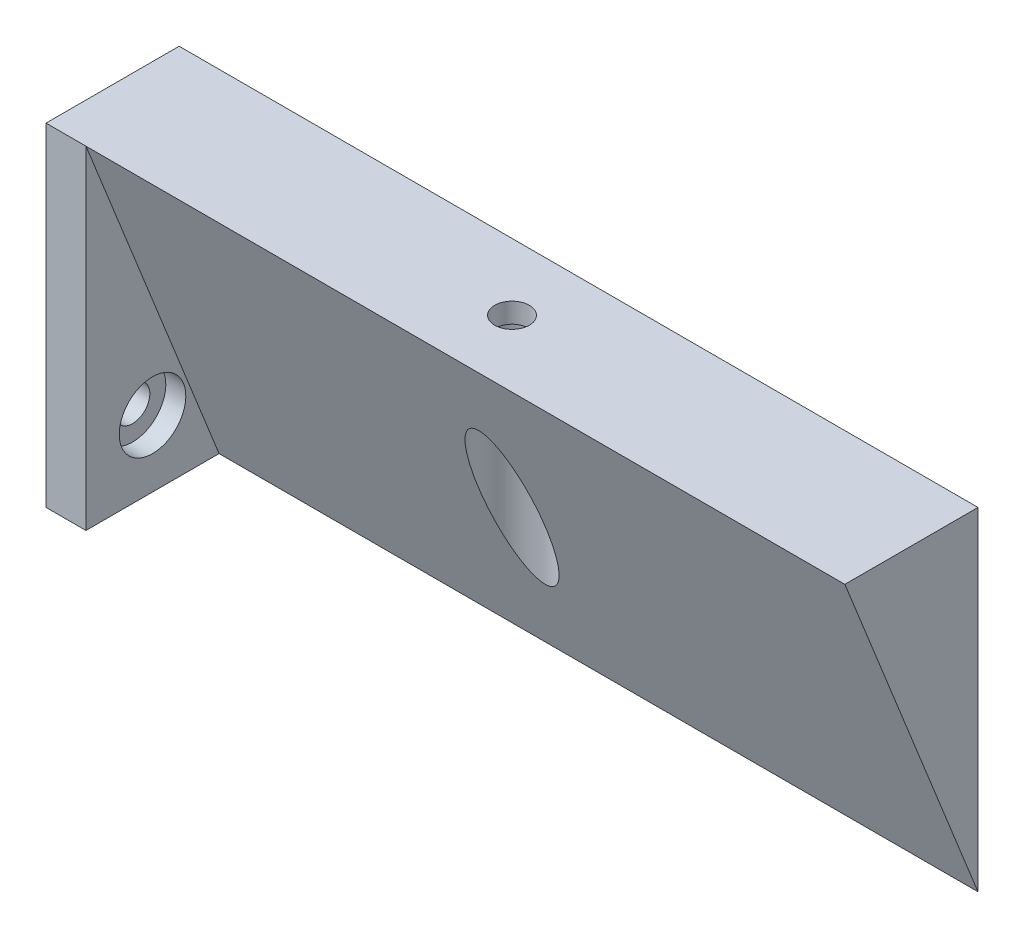
ISO-10303-21;
HEADER;
FILE_DESCRIPTION(('STEP AP214'),'2;1');
FILE_NAME('part.step','',(''),(''),'','','');
FILE_SCHEMA(('AUTOMOTIVE_DESIGN { 1 0 10303 214 1 1 1 1 }'));
ENDSEC;
DATA;
#1=APPLICATION_CONTEXT('core data for automotive mechanical design processes');
#2=APPLICATION_PROTOCOL_DEFINITION('international standard','automotive_design',2000,#1);
#3=PRODUCT_CONTEXT('',#1,'mechanical');
#4=PRODUCT('Part','Part','',(#3));
#5=PRODUCT_RELATED_PRODUCT_CATEGORY('part','',(#4));
#6=PRODUCT_DEFINITION_FORMATION('','',#4);
#7=PRODUCT_DEFINITION_CONTEXT('part definition',#1,'design');
#8=PRODUCT_DEFINITION('design','',#6,#7);
#9=PRODUCT_DEFINITION_SHAPE('','',#8);
#10=(LENGTH_UNIT() NAMED_UNIT(*) SI_UNIT(.MILLI.,.METRE.));
#11=(NAMED_UNIT(*) PLANE_ANGLE_UNIT() SI_UNIT($,.RADIAN.));
#12=(NAMED_UNIT(*) SI_UNIT($,.STERADIAN.) SOLID_ANGLE_UNIT());
#13=UNCERTAINTY_MEASURE_WITH_UNIT(LENGTH_MEASURE(1.E-05),#10,'distance_accuracy_value','');
#14=(GEOMETRIC_REPRESENTATION_CONTEXT(3) GLOBAL_UNCERTAINTY_ASSIGNED_CONTEXT((#13)) GLOBAL_UNIT_ASSIGNED_CONTEXT((#10,
#11,#12)) REPRESENTATION_CONTEXT('',''));
#15=CARTESIAN_POINT('',(0.,0.,0.));
#16=DIRECTION('',(0.,0.,1.));
#17=DIRECTION('',(1.,0.,0.));
#18=AXIS2_PLACEMENT_3D('',#15,#16,#17);
#19=CARTESIAN_POINT('',(60.,-250.,-10.));
#20=DIRECTION('',(0.,1.,0.));
#21=DIRECTION('',(0.,0.,1.));
#22=AXIS2_PLACEMENT_3D('',#19,#20,#21);
#23=CYLINDRICAL_SURFACE('',#22,5.);
#24=CARTESIAN_POINT('',(60.,25.,-10.));
#25=DIRECTION('',(0.,-0.371390676354104,0.928476690885259));
#26=DIRECTION('',(0.,0.928476690885259,0.371390676354104));
#27=AXIS2_PLACEMENT_3D('',#24,#25,#26);
#28=ELLIPSE('',#27,13.4629120178363,5.);
#29=CARTESIAN_POINT('',(60.,37.5,-5.));
#30=VERTEX_POINT('',#29);
#31=EDGE_CURVE('E131',#30,#30,#28,.T.);
#32=ORIENTED_EDGE('',*,*,#31,.T.);
#33=EDGE_LOOP('',(#32));
#34=FACE_BOUND('',#33,.T.);
#35=CARTESIAN_POINT('',(60.,47.,-10.));
#36=DIRECTION('',(0.,1.,0.));
#37=DIRECTION('',(0.,0.,1.));
#38=AXIS2_PLACEMENT_3D('',#35,#36,#37);
#39=CIRCLE('',#38,5.);
#40=CARTESIAN_POINT('',(60.,47.,-5.));
#41=VERTEX_POINT('',#40);
#42=EDGE_CURVE('E11',#41,#41,#39,.F.);
#43=ORIENTED_EDGE('',*,*,#42,.F.);
#44=EDGE_LOOP('',(#43));
#45=FACE_BOUND('',#44,.T.);
#46=ADVANCED_FACE('F37',(#34,#45),#23,.F.);
#47=CARTESIAN_POINT('',(-108.,9.99999999999997,-10.));
#48=DIRECTION('',(1.,0.,0.));
#49=DIRECTION('',(0.,1.,0.));
#50=AXIS2_PLACEMENT_3D('',#47,#48,#49);
#51=CYLINDRICAL_SURFACE('',#50,2.6);
#52=CARTESIAN_POINT('',(0.,10.,-10.));
#53=DIRECTION('',(1.,0.,0.));
#54=DIRECTION('',(0.,0.,-1.));
#55=AXIS2_PLACEMENT_3D('',#52,#53,#54);
#56=CIRCLE('',#55,2.6);
#57=CARTESIAN_POINT('',(0.,12.6,-10.));
#58=VERTEX_POINT('',#57);
#59=EDGE_CURVE('E151',#58,#58,#56,.T.);
#60=CARTESIAN_POINT('',(3.,10.,-10.));
#61=DIRECTION('',(1.,0.,0.));
#62=DIRECTION('',(0.,1.,0.));
#63=AXIS2_PLACEMENT_3D('',#60,#61,#62);
#64=CIRCLE('',#63,2.6);
#65=CARTESIAN_POINT('',(2.99999999999999,12.6,-10.));
#66=VERTEX_POINT('',#65);
#67=EDGE_CURVE('E103',#66,#66,#64,.F.);
#68=CARTESIAN_POINT('',(0.,12.6,-10.));
#69=CARTESIAN_POINT('',(0.0312499999999873,12.6,-10.));
#70=CARTESIAN_POINT('',(0.0624999999999885,12.6,-10.));
#71=CARTESIAN_POINT('',(0.124999999999991,12.6,-10.));
#72=CARTESIAN_POINT('',(0.156249999999992,12.6,-10.));
#73=CARTESIAN_POINT('',(0.21874999999999,12.6,-10.));
#74=CARTESIAN_POINT('',(0.249999999999986,12.6,-10.));
#75=CARTESIAN_POINT('',(0.312499999999984,12.6,-10.));
#76=CARTESIAN_POINT('',(0.343749999999985,12.6,-10.));
#77=CARTESIAN_POINT('',(0.406249999999988,12.6,-10.));
#78=CARTESIAN_POINT('',(0.437499999999989,12.6,-10.));
#79=CARTESIAN_POINT('',(0.499999999999987,12.6,-10.));
#80=CARTESIAN_POINT('',(0.531249999999983,12.6,-10.));
#81=CARTESIAN_POINT('',(0.593749999999981,12.6,-10.));
#82=CARTESIAN_POINT('',(0.624999999999982,12.6,-10.));
#83=CARTESIAN_POINT('',(0.687499999999984,12.6,-10.));
#84=CARTESIAN_POINT('',(0.718749999999986,12.6,-10.));
#85=CARTESIAN_POINT('',(0.781249999999988,12.6,-10.));
#86=CARTESIAN_POINT('',(0.812499999999989,12.6,-10.));
#87=CARTESIAN_POINT('',(0.874999999999992,12.6,-10.));
#88=CARTESIAN_POINT('',(0.906249999999993,12.6,-10.));
#89=CARTESIAN_POINT('',(0.96874999999999,12.6,-10.));
#90=CARTESIAN_POINT('',(0.999999999999987,12.6,-10.));
#91=CARTESIAN_POINT('',(1.06249999999998,12.6,-10.));
#92=CARTESIAN_POINT('',(1.09374999999999,12.6,-10.));
#93=CARTESIAN_POINT('',(1.15624999999999,12.6,-10.));
#94=CARTESIAN_POINT('',(1.18749999999999,12.6,-10.));
#95=CARTESIAN_POINT('',(1.24999999999999,12.6,-10.));
#96=CARTESIAN_POINT('',(1.28124999999998,12.6,-10.));
#97=CARTESIAN_POINT('',(1.34374999999998,12.6,-10.));
#98=CARTESIAN_POINT('',(1.37499999999998,12.6,-10.));
#99=CARTESIAN_POINT('',(1.43749999999999,12.6,-10.));
#100=CARTESIAN_POINT('',(1.46874999999999,12.6,-10.));
#101=CARTESIAN_POINT('',(1.53124999999999,12.6,-10.));
#102=CARTESIAN_POINT('',(1.56249999999999,12.6,-10.));
#103=CARTESIAN_POINT('',(1.62499999999999,12.6,-10.));
#104=CARTESIAN_POINT('',(1.65624999999999,12.6,-10.));
#105=CARTESIAN_POINT('',(1.71874999999999,12.6,-10.));
#106=CARTESIAN_POINT('',(1.74999999999999,12.6,-10.));
#107=CARTESIAN_POINT('',(1.81249999999999,12.6,-10.));
#108=CARTESIAN_POINT('',(1.84374999999999,12.6,-10.));
#109=CARTESIAN_POINT('',(1.90624999999999,12.6,-10.));
#110=CARTESIAN_POINT('',(1.93749999999999,12.6,-10.));
#111=CARTESIAN_POINT('',(1.99999999999999,12.6,-10.));
#112=CARTESIAN_POINT('',(2.03124999999998,12.6,-10.));
#113=CARTESIAN_POINT('',(2.09374999999998,12.6,-10.));
#114=CARTESIAN_POINT('',(2.12499999999998,12.6,-10.));
#115=CARTESIAN_POINT('',(2.18749999999999,12.6,-10.));
#116=CARTESIAN_POINT('',(2.21874999999999,12.6,-10.));
#117=CARTESIAN_POINT('',(2.28124999999999,12.6,-10.));
#118=CARTESIAN_POINT('',(2.31249999999999,12.6,-10.));
#119=CARTESIAN_POINT('',(2.37499999999999,12.6,-10.));
#120=CARTESIAN_POINT('',(2.40624999999999,12.6,-10.));
#121=CARTESIAN_POINT('',(2.46874999999999,12.6,-10.));
#122=CARTESIAN_POINT('',(2.49999999999999,12.6,-10.));
#123=CARTESIAN_POINT('',(2.56249999999999,12.6,-10.));
#124=CARTESIAN_POINT('',(2.59374999999999,12.6,-10.));
#125=CARTESIAN_POINT('',(2.65624999999999,12.6,-10.));
#126=CARTESIAN_POINT('',(2.68749999999999,12.6,-10.));
#127=CARTESIAN_POINT('',(2.74999999999999,12.6,-10.));
#128=CARTESIAN_POINT('',(2.78124999999998,12.6,-10.));
#129=CARTESIAN_POINT('',(2.84374999999998,12.6,-10.));
#130=CARTESIAN_POINT('',(2.87499999999998,12.6,-10.));
#131=CARTESIAN_POINT('',(2.93749999999999,12.6,-10.));
#132=CARTESIAN_POINT('',(2.96874999999999,12.6,-10.));
#133=CARTESIAN_POINT('',(2.99999999999999,12.6,-10.));
#134=B_SPLINE_CURVE_WITH_KNOTS('',3,(#68,#69,#70,#71,#72,#73,#74,#75,#76,#77,#78,#79,#80,#81,
#82,#83,#84,#85,#86,#87,#88,#89,#90,#91,#92,#93,#94,#95,#96,#97,#98,#99,#100,#101,#102,#103,
#104,#105,#106,#107,#108,#109,#110,#111,#112,#113,#114,#115,#116,#117,#118,#119,#120,#121,#122,
#123,#124,#125,#126,#127,#128,#129,#130,#131,#132,#133),.UNSPECIFIED.,.F.,.F.,(4,2,2,2,2,2,2,2,
2,2,2,2,2,2,2,2,2,2,2,2,2,2,2,2,2,2,2,2,2,2,2,2,4),(0.,0.0937500000000036,0.187500000000007,
0.281249999999997,0.375,0.468750000000004,0.562499999999994,0.656249999999997,0.750000000000001,
0.843750000000004,0.937500000000008,1.03125,1.125,1.21875,1.31249999999999,1.40625,1.5,1.59375,
1.68750000000001,1.78125,1.875,1.96875000000001,2.06249999999999,2.15625,2.25,2.34375000000001,
2.43750000000001,2.53125,2.625,2.71875000000001,2.8125,2.90625,3.),.UNSPECIFIED.);
#135=EDGE_CURVE('BSEAM178',#58,#66,#134,.T.);
#136=ORIENTED_EDGE('',*,*,#59,.F.);
#137=ORIENTED_EDGE('',*,*,#67,.F.);
#138=ORIENTED_EDGE('',*,*,#135,.T.);
#139=ORIENTED_EDGE('',*,*,#135,.F.);
#140=EDGE_LOOP('',(#136,#138,#137,#139));
#141=FACE_BOUND('',#140,.T.);
#142=ADVANCED_FACE('F178',(#141),#51,.F.);
#143=CARTESIAN_POINT('',(120.,50.,0.));
#144=DIRECTION('',(-1.,0.,0.));
#145=DIRECTION('',(0.,0.,1.));
#146=AXIS2_PLACEMENT_3D('',#143,#144,#145);
#147=PLANE('',#146);
#148=DIRECTION('',(0.,-0.928476690885259,-0.371390676354104));
#149=VECTOR('',#148,1.);
#150=CARTESIAN_POINT('',(120.,50.,0.));
#151=LINE('',#150,#149);
#152=CARTESIAN_POINT('',(120.,50.,0.));
#153=VERTEX_POINT('',#152);
#154=CARTESIAN_POINT('',(120.,0.,-20.));
#155=VERTEX_POINT('',#154);
#156=EDGE_CURVE('E154',#153,#155,#151,.T.);
#157=ORIENTED_EDGE('',*,*,#156,.T.);
#158=DIRECTION('',(0.,-1.,0.));
#159=VECTOR('',#158,1.);
#160=CARTESIAN_POINT('',(120.,50.,-20.));
#161=LINE('',#160,#159);
#162=CARTESIAN_POINT('',(120.,50.,-20.));
#163=VERTEX_POINT('',#162);
#164=EDGE_CURVE('E125',#163,#155,#161,.T.);
#165=ORIENTED_EDGE('',*,*,#164,.F.);
#166=DIRECTION('',(0.,0.,-1.));
#167=VECTOR('',#166,1.);
#168=CARTESIAN_POINT('',(120.,50.,0.));
#169=LINE('',#168,#167);
#170=EDGE_CURVE('E57',#153,#163,#169,.T.);
#171=ORIENTED_EDGE('',*,*,#170,.F.);
#172=EDGE_LOOP('',(#157,#165,#171));
#173=FACE_BOUND('',#172,.T.);
#174=ADVANCED_FACE('F157',(#173),#147,.F.);
#175=CARTESIAN_POINT('',(0.,50.,0.));
#176=DIRECTION('',(1.,0.,0.));
#177=DIRECTION('',(0.,0.,-1.));
#178=AXIS2_PLACEMENT_3D('',#175,#176,#177);
#179=PLANE('',#178);
#180=ORIENTED_EDGE('',*,*,#59,.T.);
#181=EDGE_LOOP('',(#180));
#182=FACE_BOUND('',#181,.T.);
#183=DIRECTION('',(0.,-1.,0.));
#184=VECTOR('',#183,1.);
#185=CARTESIAN_POINT('',(0.,50.,-20.));
#186=LINE('',#185,#184);
#187=CARTESIAN_POINT('',(0.,50.,-20.));
#188=VERTEX_POINT('',#187);
#189=CARTESIAN_POINT('',(0.,0.,-20.));
#190=VERTEX_POINT('',#189);
#191=EDGE_CURVE('E121',#188,#190,#186,.T.);
#192=ORIENTED_EDGE('',*,*,#191,.T.);
#193=DIRECTION('',(0.,0.,1.));
#194=VECTOR('',#193,1.);
#195=CARTESIAN_POINT('',(0.,0.,0.));
#196=LINE('',#195,#194);
#197=CARTESIAN_POINT('',(0.,0.,0.));
#198=VERTEX_POINT('',#197);
#199=EDGE_CURVE('E95',#190,#198,#196,.T.);
#200=ORIENTED_EDGE('',*,*,#199,.T.);
#201=DIRECTION('',(0.,-1.,0.));
#202=VECTOR('',#201,1.);
#203=CARTESIAN_POINT('',(0.,50.,0.));
#204=LINE('',#203,#202);
#205=CARTESIAN_POINT('',(0.,50.,0.));
#206=VERTEX_POINT('',#205);
#207=EDGE_CURVE('E45',#206,#198,#204,.T.);
#208=ORIENTED_EDGE('',*,*,#207,.F.);
#209=DIRECTION('',(0.,0.,1.));
#210=VECTOR('',#209,1.);
#211=CARTESIAN_POINT('',(0.,50.,0.));
#212=LINE('',#211,#210);
#213=EDGE_CURVE('E112',#188,#206,#212,.T.);
#214=ORIENTED_EDGE('',*,*,#213,.F.);
#215=EDGE_LOOP('',(#192,#200,#208,#214));
#216=FACE_BOUND('',#215,.T.);
#217=ADVANCED_FACE('F39',(#182,#216),#179,.F.);
#218=CARTESIAN_POINT('',(0.,50.,0.));
#219=DIRECTION('',(0.,0.,-1.));
#220=DIRECTION('',(-1.,0.,0.));
#221=AXIS2_PLACEMENT_3D('',#218,#219,#220);
#222=PLANE('',#221);
#223=ORIENTED_EDGE('',*,*,#207,.T.);
#224=DIRECTION('',(1.,0.,0.));
#225=VECTOR('',#224,1.);
#226=CARTESIAN_POINT('',(-108.,0.,0.));
#227=LINE('',#226,#225);
#228=CARTESIAN_POINT('',(6.,0.,0.));
#229=VERTEX_POINT('',#228);
#230=EDGE_CURVE('E87',#198,#229,#227,.T.);
#231=ORIENTED_EDGE('',*,*,#230,.T.);
#232=DIRECTION('',(0.,1.,0.));
#233=VECTOR('',#232,1.);
#234=CARTESIAN_POINT('',(6.,0.,0.));
#235=LINE('',#234,#233);
#236=CARTESIAN_POINT('',(5.99999999999999,50.,0.));
#237=VERTEX_POINT('',#236);
#238=EDGE_CURVE('E100',#229,#237,#235,.T.);
#239=ORIENTED_EDGE('',*,*,#238,.T.);
#240=DIRECTION('',(1.,0.,0.));
#241=VECTOR('',#240,1.);
#242=CARTESIAN_POINT('',(0.,50.,0.));
#243=LINE('',#242,#241);
#244=EDGE_CURVE('E118',#206,#237,#243,.T.);
#245=ORIENTED_EDGE('',*,*,#244,.F.);
#246=EDGE_LOOP('',(#223,#231,#239,#245));
#247=FACE_BOUND('',#246,.T.);
#248=ADVANCED_FACE('F99',(#247),#222,.F.);
#249=CARTESIAN_POINT('',(0.,50.,-20.));
#250=DIRECTION('',(0.,0.,1.));
#251=DIRECTION('',(1.,0.,0.));
#252=AXIS2_PLACEMENT_3D('',#249,#250,#251);
#253=PLANE('',#252);
#254=DIRECTION('',(-1.,0.,0.));
#255=VECTOR('',#254,1.);
#256=CARTESIAN_POINT('',(0.,0.,-20.));
#257=LINE('',#256,#255);
#258=CARTESIAN_POINT('',(5.99999999999999,0.,-20.));
#259=VERTEX_POINT('',#258);
#260=EDGE_CURVE('E108',#155,#259,#257,.T.);
#261=ORIENTED_EDGE('',*,*,#260,.T.);
#262=DIRECTION('',(1.,0.,0.));
#263=VECTOR('',#262,1.);
#264=CARTESIAN_POINT('',(-108.,0.,-20.));
#265=LINE('',#264,#263);
#266=EDGE_CURVE('E90',#190,#259,#265,.T.);
#267=ORIENTED_EDGE('',*,*,#266,.F.);
#268=ORIENTED_EDGE('',*,*,#191,.F.);
#269=DIRECTION('',(-1.,0.,0.));
#270=VECTOR('',#269,1.);
#271=CARTESIAN_POINT('',(0.,50.,-20.));
#272=LINE('',#271,#270);
#273=EDGE_CURVE('E52',#163,#188,#272,.T.);
#274=ORIENTED_EDGE('',*,*,#273,.F.);
#275=ORIENTED_EDGE('',*,*,#164,.T.);
#276=EDGE_LOOP('',(#261,#267,#268,#274,#275));
#277=FACE_BOUND('',#276,.T.);
#278=ADVANCED_FACE('F160',(#277),#253,.F.);
#279=CARTESIAN_POINT('',(0.,50.,0.));
#280=DIRECTION('',(0.,-1.,0.));
#281=DIRECTION('',(0.,0.,-1.));
#282=AXIS2_PLACEMENT_3D('',#279,#280,#281);
#283=PLANE('',#282);
#284=ORIENTED_EDGE('',*,*,#213,.T.);
#285=ORIENTED_EDGE('',*,*,#244,.T.);
#286=DIRECTION('',(1.,0.,0.));
#287=VECTOR('',#286,1.);
#288=CARTESIAN_POINT('',(5.99999999999999,50.,0.));
#289=LINE('',#288,#287);
#290=EDGE_CURVE('E109',#237,#153,#289,.T.);
#291=ORIENTED_EDGE('',*,*,#290,.T.);
#292=ORIENTED_EDGE('',*,*,#170,.T.);
#293=ORIENTED_EDGE('',*,*,#273,.T.);
#294=EDGE_LOOP('',(#284,#285,#291,#292,#293));
#295=FACE_BOUND('',#294,.T.);
#296=CARTESIAN_POINT('',(60.,50.,-10.));
#297=DIRECTION('',(0.,1.,0.));
#298=DIRECTION('',(0.,0.,1.));
#299=AXIS2_PLACEMENT_3D('',#296,#297,#298);
#300=CIRCLE('',#299,2.6);
#301=CARTESIAN_POINT('',(60.,50.,-7.4));
#302=VERTEX_POINT('',#301);
#303=EDGE_CURVE('E140',#302,#302,#300,.T.);
#304=ORIENTED_EDGE('',*,*,#303,.F.);
#305=EDGE_LOOP('',(#304));
#306=FACE_BOUND('',#305,.T.);
#307=ADVANCED_FACE('F163',(#295,#306),#283,.F.);
#308=CARTESIAN_POINT('',(6.,0.,-20.));
#309=DIRECTION('',(1.,0.,0.));
#310=DIRECTION('',(0.,1.,0.));
#311=AXIS2_PLACEMENT_3D('',#308,#309,#310);
#312=PLANE('',#311);
#313=CARTESIAN_POINT('',(6.,10.,-10.));
#314=DIRECTION('',(1.,0.,0.));
#315=DIRECTION('',(0.,1.,0.));
#316=AXIS2_PLACEMENT_3D('',#313,#314,#315);
#317=CIRCLE('',#316,5.);
#318=CARTESIAN_POINT('',(6.,15.,-10.));
#319=VERTEX_POINT('',#318);
#320=EDGE_CURVE('E133',#319,#319,#317,.T.);
#321=ORIENTED_EDGE('',*,*,#320,.F.);
#322=EDGE_LOOP('',(#321));
#323=FACE_BOUND('',#322,.T.);
#324=DIRECTION('',(0.,0.,1.));
#325=VECTOR('',#324,1.);
#326=CARTESIAN_POINT('',(6.,0.,-20.));
#327=LINE('',#326,#325);
#328=EDGE_CURVE('E84',#259,#229,#327,.T.);
#329=ORIENTED_EDGE('',*,*,#328,.F.);
#330=DIRECTION('',(0.,-0.928476690885259,-0.371390676354104));
#331=VECTOR('',#330,1.);
#332=CARTESIAN_POINT('',(5.99999999999999,50.,0.));
#333=LINE('',#332,#331);
#334=EDGE_CURVE('E106',#237,#259,#333,.T.);
#335=ORIENTED_EDGE('',*,*,#334,.F.);
#336=ORIENTED_EDGE('',*,*,#238,.F.);
#337=EDGE_LOOP('',(#329,#335,#336));
#338=FACE_BOUND('',#337,.T.);
#339=ADVANCED_FACE('F105',(#323,#338),#312,.T.);
#340=CARTESIAN_POINT('',(5.99999999999999,50.,0.));
#341=DIRECTION('',(0.,-0.371390676354104,0.928476690885259));
#342=DIRECTION('',(0.,-0.928476690885259,-0.371390676354104));
#343=AXIS2_PLACEMENT_3D('',#340,#341,#342);
#344=PLANE('',#343);
#345=ORIENTED_EDGE('',*,*,#31,.F.);
#346=EDGE_LOOP('',(#345));
#347=FACE_BOUND('',#346,.T.);
#348=ORIENTED_EDGE('',*,*,#156,.F.);
#349=ORIENTED_EDGE('',*,*,#290,.F.);
#350=ORIENTED_EDGE('',*,*,#334,.T.);
#351=ORIENTED_EDGE('',*,*,#260,.F.);
#352=EDGE_LOOP('',(#348,#349,#350,#351));
#353=FACE_BOUND('',#352,.T.);
#354=ADVANCED_FACE('F165',(#347,#353),#344,.T.);
#355=CARTESIAN_POINT('',(-108.,0.,-20.));
#356=DIRECTION('',(0.,1.,0.));
#357=DIRECTION('',(-1.,0.,0.));
#358=AXIS2_PLACEMENT_3D('',#355,#356,#357);
#359=PLANE('',#358);
#360=ORIENTED_EDGE('',*,*,#266,.T.);
#361=ORIENTED_EDGE('',*,*,#328,.T.);
#362=ORIENTED_EDGE('',*,*,#230,.F.);
#363=ORIENTED_EDGE('',*,*,#199,.F.);
#364=EDGE_LOOP('',(#360,#361,#362,#363));
#365=FACE_BOUND('',#364,.T.);
#366=ADVANCED_FACE('F86',(#365),#359,.F.);
#367=CARTESIAN_POINT('',(3.,10.,-10.));
#368=DIRECTION('',(1.,0.,0.));
#369=DIRECTION('',(0.,1.,0.));
#370=AXIS2_PLACEMENT_3D('',#367,#368,#369);
#371=PLANE('',#370);
#372=CARTESIAN_POINT('',(3.,10.,-10.));
#373=DIRECTION('',(1.,0.,0.));
#374=DIRECTION('',(0.,1.,0.));
#375=AXIS2_PLACEMENT_3D('',#372,#373,#374);
#376=CIRCLE('',#375,5.);
#377=CARTESIAN_POINT('',(3.,15.,-10.));
#378=VERTEX_POINT('',#377);
#379=EDGE_CURVE('E130',#378,#378,#376,.T.);
#380=ORIENTED_EDGE('',*,*,#379,.T.);
#381=EDGE_LOOP('',(#380));
#382=FACE_BOUND('',#381,.T.);
#383=ORIENTED_EDGE('',*,*,#67,.T.);
#384=EDGE_LOOP('',(#383));
#385=FACE_BOUND('',#384,.T.);
#386=ADVANCED_FACE('F173',(#382,#385),#371,.T.);
#387=CARTESIAN_POINT('',(3.,10.,-10.));
#388=DIRECTION('',(1.,0.,0.));
#389=DIRECTION('',(0.,1.,0.));
#390=AXIS2_PLACEMENT_3D('',#387,#388,#389);
#391=CYLINDRICAL_SURFACE('',#390,5.);
#392=ORIENTED_EDGE('',*,*,#379,.F.);
#393=EDGE_LOOP('',(#392));
#394=FACE_BOUND('',#393,.T.);
#395=ORIENTED_EDGE('',*,*,#320,.T.);
#396=EDGE_LOOP('',(#395));
#397=FACE_BOUND('',#396,.T.);
#398=ADVANCED_FACE('F192',(#394,#397),#391,.F.);
#399=CARTESIAN_POINT('',(60.,47.,-10.));
#400=DIRECTION('',(0.,1.,0.));
#401=DIRECTION('',(0.,0.,1.));
#402=AXIS2_PLACEMENT_3D('',#399,#400,#401);
#403=PLANE('',#402);
#404=CARTESIAN_POINT('',(60.,47.,-10.));
#405=DIRECTION('',(0.,1.,0.));
#406=DIRECTION('',(0.,0.,1.));
#407=AXIS2_PLACEMENT_3D('',#404,#405,#406);
#408=CIRCLE('',#407,2.6);
#409=CARTESIAN_POINT('',(60.,47.,-7.4));
#410=VERTEX_POINT('',#409);
#411=EDGE_CURVE('E134',#410,#410,#408,.T.);
#412=ORIENTED_EDGE('',*,*,#411,.T.);
#413=EDGE_LOOP('',(#412));
#414=FACE_BOUND('',#413,.T.);
#415=ORIENTED_EDGE('',*,*,#42,.T.);
#416=EDGE_LOOP('',(#415));
#417=FACE_BOUND('',#416,.T.);
#418=ADVANCED_FACE('F188',(#414,#417),#403,.F.);
#419=CARTESIAN_POINT('',(60.,47.,-10.));
#420=DIRECTION('',(0.,1.,0.));
#421=DIRECTION('',(0.,0.,1.));
#422=AXIS2_PLACEMENT_3D('',#419,#420,#421);
#423=CYLINDRICAL_SURFACE('',#422,2.6);
#424=ORIENTED_EDGE('',*,*,#411,.F.);
#425=EDGE_LOOP('',(#424));
#426=FACE_BOUND('',#425,.T.);
#427=ORIENTED_EDGE('',*,*,#303,.T.);
#428=EDGE_LOOP('',(#427));
#429=FACE_BOUND('',#428,.T.);
#430=ADVANCED_FACE('F199',(#426,#429),#423,.F.);
#431=CLOSED_SHELL('',(#46,#142,#174,#217,#248,#278,#307,#339,#354,#366,#386,#398,#418,#430));
#432=MANIFOLD_SOLID_BREP('B2',#431);
#433=ADVANCED_BREP_SHAPE_REPRESENTATION('',(#18,#432),#14);
#434=SHAPE_DEFINITION_REPRESENTATION(#9,#433);
ENDSEC;
END-ISO-10303-21;
